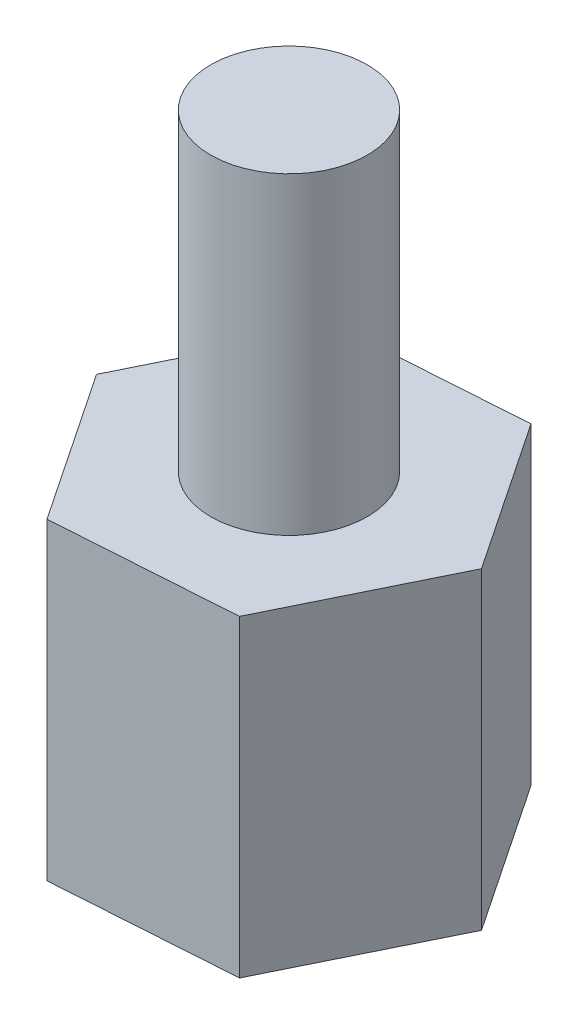
ISO-10303-21;
HEADER;
FILE_DESCRIPTION(('STEP AP214'),'2;1');
FILE_NAME('part.step','',(''),(''),'','','');
FILE_SCHEMA(('AUTOMOTIVE_DESIGN { 1 0 10303 214 1 1 1 1 }'));
ENDSEC;
DATA;
#1=APPLICATION_CONTEXT('core data for automotive mechanical design processes');
#2=APPLICATION_PROTOCOL_DEFINITION('international standard','automotive_design',2000,#1);
#3=PRODUCT_CONTEXT('',#1,'mechanical');
#4=PRODUCT('Part','Part','',(#3));
#5=PRODUCT_RELATED_PRODUCT_CATEGORY('part','',(#4));
#6=PRODUCT_DEFINITION_FORMATION('','',#4);
#7=PRODUCT_DEFINITION_CONTEXT('part definition',#1,'design');
#8=PRODUCT_DEFINITION('design','',#6,#7);
#9=PRODUCT_DEFINITION_SHAPE('','',#8);
#10=(LENGTH_UNIT() NAMED_UNIT(*) SI_UNIT(.MILLI.,.METRE.));
#11=(NAMED_UNIT(*) PLANE_ANGLE_UNIT() SI_UNIT($,.RADIAN.));
#12=(NAMED_UNIT(*) SI_UNIT($,.STERADIAN.) SOLID_ANGLE_UNIT());
#13=UNCERTAINTY_MEASURE_WITH_UNIT(LENGTH_MEASURE(1.E-05),#10,'distance_accuracy_value','');
#14=(GEOMETRIC_REPRESENTATION_CONTEXT(3) GLOBAL_UNCERTAINTY_ASSIGNED_CONTEXT((#13)) GLOBAL_UNIT_ASSIGNED_CONTEXT((#10,
#11,#12)) REPRESENTATION_CONTEXT('',''));
#15=CARTESIAN_POINT('',(0.,0.,0.));
#16=DIRECTION('',(0.,0.,1.));
#17=DIRECTION('',(1.,0.,0.));
#18=AXIS2_PLACEMENT_3D('',#15,#16,#17);
#19=CARTESIAN_POINT('',(3.65795020263365,6.35,-0.245425443639819));
#20=DIRECTION('',(-0.83061112362572,0.,0.556852908144709));
#21=DIRECTION('',(0.556852908144709,0.,0.83061112362572));
#22=AXIS2_PLACEMENT_3D('',#19,#20,#21);
#23=PLANE('',#22);
#24=DIRECTION('',(-0.556852908144709,0.,-0.83061112362572));
#25=VECTOR('',#24,1.);
#26=CARTESIAN_POINT('',(3.65795020263365,0.,-0.245425443639819));
#27=LINE('',#26,#25);
#28=CARTESIAN_POINT('',(3.65795020263365,0.,-0.245425443639819));
#29=VERTEX_POINT('',#28);
#30=CARTESIAN_POINT('',(1.61643043238967,0.,-3.29059052307908));
#31=VERTEX_POINT('',#30);
#32=EDGE_CURVE('E117',#29,#31,#27,.T.);
#33=ORIENTED_EDGE('',*,*,#32,.T.);
#34=DIRECTION('',(0.,-1.,0.));
#35=VECTOR('',#34,1.);
#36=CARTESIAN_POINT('',(1.61643043238967,6.35,-3.29059052307908));
#37=LINE('',#36,#35);
#38=CARTESIAN_POINT('',(1.61643043238967,6.35,-3.29059052307908));
#39=VERTEX_POINT('',#38);
#40=EDGE_CURVE('E11',#39,#31,#37,.T.);
#41=ORIENTED_EDGE('',*,*,#40,.F.);
#42=DIRECTION('',(-0.556852908144709,0.,-0.83061112362572));
#43=VECTOR('',#42,1.);
#44=CARTESIAN_POINT('',(3.65795020263365,6.35,-0.245425443639819));
#45=LINE('',#44,#43);
#46=CARTESIAN_POINT('',(3.65795020263365,6.35,-0.245425443639819));
#47=VERTEX_POINT('',#46);
#48=EDGE_CURVE('E128',#47,#39,#45,.T.);
#49=ORIENTED_EDGE('',*,*,#48,.F.);
#50=DIRECTION('',(0.,-1.,0.));
#51=VECTOR('',#50,1.);
#52=CARTESIAN_POINT('',(3.65795020263365,6.35,-0.245425443639819));
#53=LINE('',#52,#51);
#54=EDGE_CURVE('E113',#47,#29,#53,.T.);
#55=ORIENTED_EDGE('',*,*,#54,.T.);
#56=EDGE_LOOP('',(#33,#41,#49,#55));
#57=FACE_BOUND('',#56,.T.);
#58=ADVANCED_FACE('F33',(#57),#23,.F.);
#59=CARTESIAN_POINT('',(1.61643043238967,6.35,-3.29059052307908));
#60=DIRECTION('',(0.0669432028117005,0.,0.997756787798164));
#61=DIRECTION('',(0.997756787798165,0.,-0.0669432028117005));
#62=AXIS2_PLACEMENT_3D('',#59,#60,#61);
#63=PLANE('',#62);
#64=DIRECTION('',(-0.997756787798164,0.,0.0669432028117005));
#65=VECTOR('',#64,1.);
#66=CARTESIAN_POINT('',(1.61643043238967,0.,-3.29059052307908));
#67=LINE('',#66,#65);
#68=CARTESIAN_POINT('',(-2.04151977024397,0.,-3.04516507943926));
#69=VERTEX_POINT('',#68);
#70=EDGE_CURVE('E120',#31,#69,#67,.T.);
#71=ORIENTED_EDGE('',*,*,#70,.T.);
#72=DIRECTION('',(0.,-1.,0.));
#73=VECTOR('',#72,1.);
#74=CARTESIAN_POINT('',(-2.04151977024397,6.35,-3.04516507943926));
#75=LINE('',#74,#73);
#76=CARTESIAN_POINT('',(-2.04151977024397,6.35,-3.04516507943926));
#77=VERTEX_POINT('',#76);
#78=EDGE_CURVE('E41',#77,#69,#75,.T.);
#79=ORIENTED_EDGE('',*,*,#78,.F.);
#80=DIRECTION('',(-0.997756787798164,0.,0.0669432028117005));
#81=VECTOR('',#80,1.);
#82=CARTESIAN_POINT('',(1.61643043238967,6.35,-3.29059052307908));
#83=LINE('',#82,#81);
#84=EDGE_CURVE('E86',#39,#77,#83,.T.);
#85=ORIENTED_EDGE('',*,*,#84,.F.);
#86=ORIENTED_EDGE('',*,*,#40,.T.);
#87=EDGE_LOOP('',(#71,#79,#85,#86));
#88=FACE_BOUND('',#87,.T.);
#89=ADVANCED_FACE('F153',(#88),#63,.F.);
#90=CARTESIAN_POINT('',(-2.04151977024397,6.35,-3.04516507943926));
#91=DIRECTION('',(0.89755432643742,0.,0.440903879653456));
#92=DIRECTION('',(0.440903879653456,0.,-0.89755432643742));
#93=AXIS2_PLACEMENT_3D('',#90,#91,#92);
#94=PLANE('',#93);
#95=DIRECTION('',(-0.440903879653456,0.,0.89755432643742));
#96=VECTOR('',#95,1.);
#97=CARTESIAN_POINT('',(-2.04151977024397,0.,-3.04516507943926));
#98=LINE('',#97,#96);
#99=CARTESIAN_POINT('',(-3.65795020263365,0.,0.245425443639819));
#100=VERTEX_POINT('',#99);
#101=EDGE_CURVE('E123',#69,#100,#98,.T.);
#102=ORIENTED_EDGE('',*,*,#101,.T.);
#103=DIRECTION('',(0.,-1.,0.));
#104=VECTOR('',#103,1.);
#105=CARTESIAN_POINT('',(-3.65795020263365,6.35,0.245425443639819));
#106=LINE('',#105,#104);
#107=CARTESIAN_POINT('',(-3.65795020263365,6.35,0.245425443639819));
#108=VERTEX_POINT('',#107);
#109=EDGE_CURVE('E108',#108,#100,#106,.T.);
#110=ORIENTED_EDGE('',*,*,#109,.F.);
#111=DIRECTION('',(-0.440903879653456,0.,0.89755432643742));
#112=VECTOR('',#111,1.);
#113=CARTESIAN_POINT('',(-2.04151977024397,6.35,-3.04516507943926));
#114=LINE('',#113,#112);
#115=EDGE_CURVE('E99',#77,#108,#114,.T.);
#116=ORIENTED_EDGE('',*,*,#115,.F.);
#117=ORIENTED_EDGE('',*,*,#78,.T.);
#118=EDGE_LOOP('',(#102,#110,#116,#117));
#119=FACE_BOUND('',#118,.T.);
#120=ADVANCED_FACE('F134',(#119),#94,.F.);
#121=CARTESIAN_POINT('',(-3.65795020263365,6.35,0.245425443639819));
#122=DIRECTION('',(0.83061112362572,0.,-0.556852908144709));
#123=DIRECTION('',(-0.556852908144709,0.,-0.83061112362572));
#124=AXIS2_PLACEMENT_3D('',#121,#122,#123);
#125=PLANE('',#124);
#126=DIRECTION('',(0.556852908144709,0.,0.83061112362572));
#127=VECTOR('',#126,1.);
#128=CARTESIAN_POINT('',(-3.65795020263365,0.,0.245425443639819));
#129=LINE('',#128,#127);
#130=CARTESIAN_POINT('',(-1.61643043238967,0.,3.29059052307908));
#131=VERTEX_POINT('',#130);
#132=EDGE_CURVE('E107',#100,#131,#129,.T.);
#133=ORIENTED_EDGE('',*,*,#132,.T.);
#134=DIRECTION('',(0.,-1.,0.));
#135=VECTOR('',#134,1.);
#136=CARTESIAN_POINT('',(-1.61643043238967,6.35,3.29059052307908));
#137=LINE('',#136,#135);
#138=CARTESIAN_POINT('',(-1.61643043238967,6.35,3.29059052307908));
#139=VERTEX_POINT('',#138);
#140=EDGE_CURVE('E104',#139,#131,#137,.T.);
#141=ORIENTED_EDGE('',*,*,#140,.F.);
#142=DIRECTION('',(0.556852908144709,0.,0.83061112362572));
#143=VECTOR('',#142,1.);
#144=CARTESIAN_POINT('',(-3.65795020263365,6.35,0.245425443639819));
#145=LINE('',#144,#143);
#146=EDGE_CURVE('E93',#108,#139,#145,.T.);
#147=ORIENTED_EDGE('',*,*,#146,.F.);
#148=ORIENTED_EDGE('',*,*,#109,.T.);
#149=EDGE_LOOP('',(#133,#141,#147,#148));
#150=FACE_BOUND('',#149,.T.);
#151=ADVANCED_FACE('F105',(#150),#125,.F.);
#152=CARTESIAN_POINT('',(-1.61643043238967,6.35,3.29059052307908));
#153=DIRECTION('',(-0.0669432028117005,0.,-0.997756787798164));
#154=DIRECTION('',(-0.997756787798165,0.,0.0669432028117006));
#155=AXIS2_PLACEMENT_3D('',#152,#153,#154);
#156=PLANE('',#155);
#157=DIRECTION('',(0.997756787798165,0.,-0.0669432028117005));
#158=VECTOR('',#157,1.);
#159=CARTESIAN_POINT('',(-1.61643043238967,0.,3.29059052307908));
#160=LINE('',#159,#158);
#161=CARTESIAN_POINT('',(2.04151977024397,0.,3.04516507943926));
#162=VERTEX_POINT('',#161);
#163=EDGE_CURVE('E72',#131,#162,#160,.T.);
#164=ORIENTED_EDGE('',*,*,#163,.T.);
#165=DIRECTION('',(0.,-1.,0.));
#166=VECTOR('',#165,1.);
#167=CARTESIAN_POINT('',(2.04151977024397,6.35,3.04516507943926));
#168=LINE('',#167,#166);
#169=CARTESIAN_POINT('',(2.04151977024397,6.35,3.04516507943926));
#170=VERTEX_POINT('',#169);
#171=EDGE_CURVE('E109',#170,#162,#168,.T.);
#172=ORIENTED_EDGE('',*,*,#171,.F.);
#173=DIRECTION('',(0.997756787798165,0.,-0.0669432028117005));
#174=VECTOR('',#173,1.);
#175=CARTESIAN_POINT('',(-1.61643043238967,6.35,3.29059052307908));
#176=LINE('',#175,#174);
#177=EDGE_CURVE('E97',#139,#170,#176,.T.);
#178=ORIENTED_EDGE('',*,*,#177,.F.);
#179=ORIENTED_EDGE('',*,*,#140,.T.);
#180=EDGE_LOOP('',(#164,#172,#178,#179));
#181=FACE_BOUND('',#180,.T.);
#182=ADVANCED_FACE('F111',(#181),#156,.F.);
#183=CARTESIAN_POINT('',(2.04151977024397,6.35,3.04516507943926));
#184=DIRECTION('',(-0.89755432643742,0.,-0.440903879653456));
#185=DIRECTION('',(-0.440903879653456,0.,0.89755432643742));
#186=AXIS2_PLACEMENT_3D('',#183,#184,#185);
#187=PLANE('',#186);
#188=DIRECTION('',(0.440903879653456,0.,-0.89755432643742));
#189=VECTOR('',#188,1.);
#190=CARTESIAN_POINT('',(2.04151977024397,0.,3.04516507943926));
#191=LINE('',#190,#189);
#192=EDGE_CURVE('E78',#162,#29,#191,.T.);
#193=ORIENTED_EDGE('',*,*,#192,.T.);
#194=ORIENTED_EDGE('',*,*,#54,.F.);
#195=DIRECTION('',(0.440903879653456,0.,-0.89755432643742));
#196=VECTOR('',#195,1.);
#197=CARTESIAN_POINT('',(2.04151977024397,6.35,3.04516507943926));
#198=LINE('',#197,#196);
#199=EDGE_CURVE('E49',#170,#47,#198,.T.);
#200=ORIENTED_EDGE('',*,*,#199,.F.);
#201=ORIENTED_EDGE('',*,*,#171,.T.);
#202=EDGE_LOOP('',(#193,#194,#200,#201));
#203=FACE_BOUND('',#202,.T.);
#204=ADVANCED_FACE('F141',(#203),#187,.F.);
#205=CARTESIAN_POINT('',(0.,6.35,0.));
#206=DIRECTION('',(0.,1.,0.));
#207=DIRECTION('',(0.,0.,1.));
#208=AXIS2_PLACEMENT_3D('',#205,#206,#207);
#209=PLANE('',#208);
#210=CARTESIAN_POINT('',(0.,6.35,0.));
#211=DIRECTION('',(0.,1.,0.));
#212=DIRECTION('',(0.,0.,1.));
#213=AXIS2_PLACEMENT_3D('',#210,#211,#212);
#214=CIRCLE('',#213,1.5875);
#215=CARTESIAN_POINT('',(0.,6.35,1.5875));
#216=VERTEX_POINT('',#215);
#217=EDGE_CURVE('E236',#216,#216,#214,.T.);
#218=ORIENTED_EDGE('',*,*,#217,.F.);
#219=EDGE_LOOP('',(#218));
#220=FACE_BOUND('',#219,.T.);
#221=ORIENTED_EDGE('',*,*,#48,.T.);
#222=ORIENTED_EDGE('',*,*,#84,.T.);
#223=ORIENTED_EDGE('',*,*,#115,.T.);
#224=ORIENTED_EDGE('',*,*,#146,.T.);
#225=ORIENTED_EDGE('',*,*,#177,.T.);
#226=ORIENTED_EDGE('',*,*,#199,.T.);
#227=EDGE_LOOP('',(#221,#222,#223,#224,#225,#226));
#228=FACE_BOUND('',#227,.T.);
#229=ADVANCED_FACE('F95',(#220,#228),#209,.T.);
#230=CARTESIAN_POINT('',(0.,0.,0.));
#231=DIRECTION('',(0.,1.,0.));
#232=DIRECTION('',(0.,0.,1.));
#233=AXIS2_PLACEMENT_3D('',#230,#231,#232);
#234=PLANE('',#233);
#235=CARTESIAN_POINT('',(0.,0.,0.));
#236=DIRECTION('',(0.,-1.,0.));
#237=DIRECTION('',(0.,0.,-1.));
#238=AXIS2_PLACEMENT_3D('',#235,#236,#237);
#239=CIRCLE('',#238,1.5875);
#240=CARTESIAN_POINT('',(0.,0.,-1.5875));
#241=VERTEX_POINT('',#240);
#242=EDGE_CURVE('E237',#241,#241,#239,.T.);
#243=ORIENTED_EDGE('',*,*,#242,.F.);
#244=EDGE_LOOP('',(#243));
#245=FACE_BOUND('',#244,.T.);
#246=ORIENTED_EDGE('',*,*,#32,.F.);
#247=ORIENTED_EDGE('',*,*,#192,.F.);
#248=ORIENTED_EDGE('',*,*,#163,.F.);
#249=ORIENTED_EDGE('',*,*,#132,.F.);
#250=ORIENTED_EDGE('',*,*,#101,.F.);
#251=ORIENTED_EDGE('',*,*,#70,.F.);
#252=EDGE_LOOP('',(#246,#247,#248,#249,#250,#251));
#253=FACE_BOUND('',#252,.T.);
#254=ADVANCED_FACE('F137',(#245,#253),#234,.F.);
#255=CARTESIAN_POINT('',(0.,12.7,0.));
#256=DIRECTION('',(0.,-1.,0.));
#257=DIRECTION('',(0.,0.,-1.));
#258=AXIS2_PLACEMENT_3D('',#255,#256,#257);
#259=CYLINDRICAL_SURFACE('',#258,1.5875);
#260=CARTESIAN_POINT('',(0.,12.7,0.));
#261=DIRECTION('',(0.,1.,0.));
#262=DIRECTION('',(0.,0.,1.));
#263=AXIS2_PLACEMENT_3D('',#260,#261,#262);
#264=CIRCLE('',#263,1.5875);
#265=CARTESIAN_POINT('',(0.,12.7,1.5875));
#266=VERTEX_POINT('',#265);
#267=EDGE_CURVE('E121',#266,#266,#264,.T.);
#268=ORIENTED_EDGE('',*,*,#267,.F.);
#269=EDGE_LOOP('',(#268));
#270=FACE_BOUND('',#269,.T.);
#271=ORIENTED_EDGE('',*,*,#217,.T.);
#272=EDGE_LOOP('',(#271));
#273=FACE_BOUND('',#272,.T.);
#274=ADVANCED_FACE('F188',(#270,#273),#259,.T.);
#275=CARTESIAN_POINT('',(0.,12.7,0.));
#276=DIRECTION('',(0.,1.,0.));
#277=DIRECTION('',(0.,0.,1.));
#278=AXIS2_PLACEMENT_3D('',#275,#276,#277);
#279=PLANE('',#278);
#280=ORIENTED_EDGE('',*,*,#267,.T.);
#281=EDGE_LOOP('',(#280));
#282=FACE_BOUND('',#281,.T.);
#283=ADVANCED_FACE('F193',(#282),#279,.T.);
#284=CARTESIAN_POINT('',(0.,4.7625,0.));
#285=DIRECTION('',(0.,-1.,0.));
#286=DIRECTION('',(0.,0.,-1.));
#287=AXIS2_PLACEMENT_3D('',#284,#285,#286);
#288=CYLINDRICAL_SURFACE('',#287,1.5875);
#289=CARTESIAN_POINT('',(0.,4.7625,0.));
#290=DIRECTION('',(0.,-1.,0.));
#291=DIRECTION('',(0.,0.,-1.));
#292=AXIS2_PLACEMENT_3D('',#289,#290,#291);
#293=CIRCLE('',#292,1.5875);
#294=CARTESIAN_POINT('',(0.,4.7625,-1.5875));
#295=VERTEX_POINT('',#294);
#296=EDGE_CURVE('E235',#295,#295,#293,.T.);
#297=CARTESIAN_POINT('',(0.,4.7625,-1.5875));
#298=CARTESIAN_POINT('',(0.,4.712890625,-1.5875));
#299=CARTESIAN_POINT('',(0.,4.66328125,-1.5875));
#300=CARTESIAN_POINT('',(0.,4.5640625,-1.5875));
#301=CARTESIAN_POINT('',(0.,4.514453125,-1.5875));
#302=CARTESIAN_POINT('',(0.,4.415234375,-1.5875));
#303=CARTESIAN_POINT('',(0.,4.365625,-1.5875));
#304=CARTESIAN_POINT('',(0.,4.26640625,-1.5875));
#305=CARTESIAN_POINT('',(0.,4.216796875,-1.5875));
#306=CARTESIAN_POINT('',(0.,4.117578125,-1.5875));
#307=CARTESIAN_POINT('',(0.,4.06796875,-1.5875));
#308=CARTESIAN_POINT('',(0.,3.96875,-1.5875));
#309=CARTESIAN_POINT('',(0.,3.919140625,-1.5875));
#310=CARTESIAN_POINT('',(0.,3.819921875,-1.5875));
#311=CARTESIAN_POINT('',(0.,3.7703125,-1.5875));
#312=CARTESIAN_POINT('',(0.,3.67109375,-1.5875));
#313=CARTESIAN_POINT('',(0.,3.621484375,-1.5875));
#314=CARTESIAN_POINT('',(0.,3.522265625,-1.5875));
#315=CARTESIAN_POINT('',(0.,3.47265625,-1.5875));
#316=CARTESIAN_POINT('',(0.,3.3734375,-1.5875));
#317=CARTESIAN_POINT('',(0.,3.323828125,-1.5875));
#318=CARTESIAN_POINT('',(0.,3.224609375,-1.5875));
#319=CARTESIAN_POINT('',(0.,3.175,-1.5875));
#320=CARTESIAN_POINT('',(0.,3.07578125,-1.5875));
#321=CARTESIAN_POINT('',(0.,3.026171875,-1.5875));
#322=CARTESIAN_POINT('',(0.,2.926953125,-1.5875));
#323=CARTESIAN_POINT('',(0.,2.87734375,-1.5875));
#324=CARTESIAN_POINT('',(0.,2.778125,-1.5875));
#325=CARTESIAN_POINT('',(0.,2.728515625,-1.5875));
#326=CARTESIAN_POINT('',(0.,2.629296875,-1.5875));
#327=CARTESIAN_POINT('',(0.,2.5796875,-1.5875));
#328=CARTESIAN_POINT('',(0.,2.48046875,-1.5875));
#329=CARTESIAN_POINT('',(0.,2.430859375,-1.5875));
#330=CARTESIAN_POINT('',(0.,2.331640625,-1.5875));
#331=CARTESIAN_POINT('',(0.,2.28203125,-1.5875));
#332=CARTESIAN_POINT('',(0.,2.1828125,-1.5875));
#333=CARTESIAN_POINT('',(0.,2.133203125,-1.5875));
#334=CARTESIAN_POINT('',(0.,2.033984375,-1.5875));
#335=CARTESIAN_POINT('',(0.,1.984375,-1.5875));
#336=CARTESIAN_POINT('',(0.,1.88515625,-1.5875));
#337=CARTESIAN_POINT('',(0.,1.835546875,-1.5875));
#338=CARTESIAN_POINT('',(0.,1.736328125,-1.5875));
#339=CARTESIAN_POINT('',(0.,1.68671875,-1.5875));
#340=CARTESIAN_POINT('',(0.,1.5875,-1.5875));
#341=CARTESIAN_POINT('',(0.,1.537890625,-1.5875));
#342=CARTESIAN_POINT('',(0.,1.438671875,-1.5875));
#343=CARTESIAN_POINT('',(0.,1.3890625,-1.5875));
#344=CARTESIAN_POINT('',(0.,1.28984375,-1.5875));
#345=CARTESIAN_POINT('',(0.,1.240234375,-1.5875));
#346=CARTESIAN_POINT('',(0.,1.141015625,-1.5875));
#347=CARTESIAN_POINT('',(0.,1.09140625,-1.5875));
#348=CARTESIAN_POINT('',(0.,0.9921875,-1.5875));
#349=CARTESIAN_POINT('',(0.,0.942578125,-1.5875));
#350=CARTESIAN_POINT('',(0.,0.843359375,-1.5875));
#351=CARTESIAN_POINT('',(0.,0.79375,-1.5875));
#352=CARTESIAN_POINT('',(0.,0.69453125,-1.5875));
#353=CARTESIAN_POINT('',(0.,0.644921875,-1.5875));
#354=CARTESIAN_POINT('',(0.,0.545703125,-1.5875));
#355=CARTESIAN_POINT('',(0.,0.49609375,-1.5875));
#356=CARTESIAN_POINT('',(0.,0.396875,-1.5875));
#357=CARTESIAN_POINT('',(0.,0.347265625,-1.5875));
#358=CARTESIAN_POINT('',(0.,0.248046875,-1.5875));
#359=CARTESIAN_POINT('',(0.,0.1984375,-1.5875));
#360=CARTESIAN_POINT('',(0.,0.09921875,-1.5875));
#361=CARTESIAN_POINT('',(0.,0.049609375,-1.5875));
#362=CARTESIAN_POINT('',(0.,0.,-1.5875));
#363=B_SPLINE_CURVE_WITH_KNOTS('',3,(#297,#298,#299,#300,#301,#302,#303,#304,#305,#306,#307,
#308,#309,#310,#311,#312,#313,#314,#315,#316,#317,#318,#319,#320,#321,#322,#323,#324,#325,#326,
#327,#328,#329,#330,#331,#332,#333,#334,#335,#336,#337,#338,#339,#340,#341,#342,#343,#344,#345,
#346,#347,#348,#349,#350,#351,#352,#353,#354,#355,#356,#357,#358,#359,#360,#361,#362),
.UNSPECIFIED.,.F.,.F.,(4,2,2,2,2,2,2,2,2,2,2,2,2,2,2,2,2,2,2,2,2,2,2,2,2,2,2,2,2,2,2,2,4),(0.,
0.148828124999999,0.297656249999999,0.446484374999999,0.595312499999999,0.744140625,0.89296875,
1.041796875,1.190625,1.339453125,1.48828125,1.637109375,1.7859375,1.934765625,2.08359375,
2.232421875,2.38125,2.530078125,2.67890625,2.827734375,2.9765625,3.125390625,3.27421875,
3.423046875,3.571875,3.720703125,3.86953125,4.018359375,4.1671875,4.316015625,4.46484375,
4.613671875,4.7625),.UNSPECIFIED.);
#364=EDGE_CURVE('BSEAM203',#295,#241,#363,.T.);
#365=ORIENTED_EDGE('',*,*,#296,.F.);
#366=ORIENTED_EDGE('',*,*,#242,.T.);
#367=ORIENTED_EDGE('',*,*,#364,.T.);
#368=ORIENTED_EDGE('',*,*,#364,.F.);
#369=EDGE_LOOP('',(#365,#367,#366,#368));
#370=FACE_BOUND('',#369,.T.);
#371=ADVANCED_FACE('F203',(#370),#288,.F.);
#372=CARTESIAN_POINT('',(0.,4.7625,0.));
#373=DIRECTION('',(0.,-1.,0.));
#374=DIRECTION('',(0.,0.,-1.));
#375=AXIS2_PLACEMENT_3D('',#372,#373,#374);
#376=PLANE('',#375);
#377=ORIENTED_EDGE('',*,*,#296,.T.);
#378=EDGE_LOOP('',(#377));
#379=FACE_BOUND('',#378,.T.);
#380=ADVANCED_FACE('F219',(#379),#376,.T.);
#381=CLOSED_SHELL('',(#58,#89,#120,#151,#182,#204,#229,#254,#274,#283,#371,#380));
#382=MANIFOLD_SOLID_BREP('B2',#381);
#383=ADVANCED_BREP_SHAPE_REPRESENTATION('',(#18,#382),#14);
#384=SHAPE_DEFINITION_REPRESENTATION(#9,#383);
ENDSEC;
END-ISO-10303-21;
